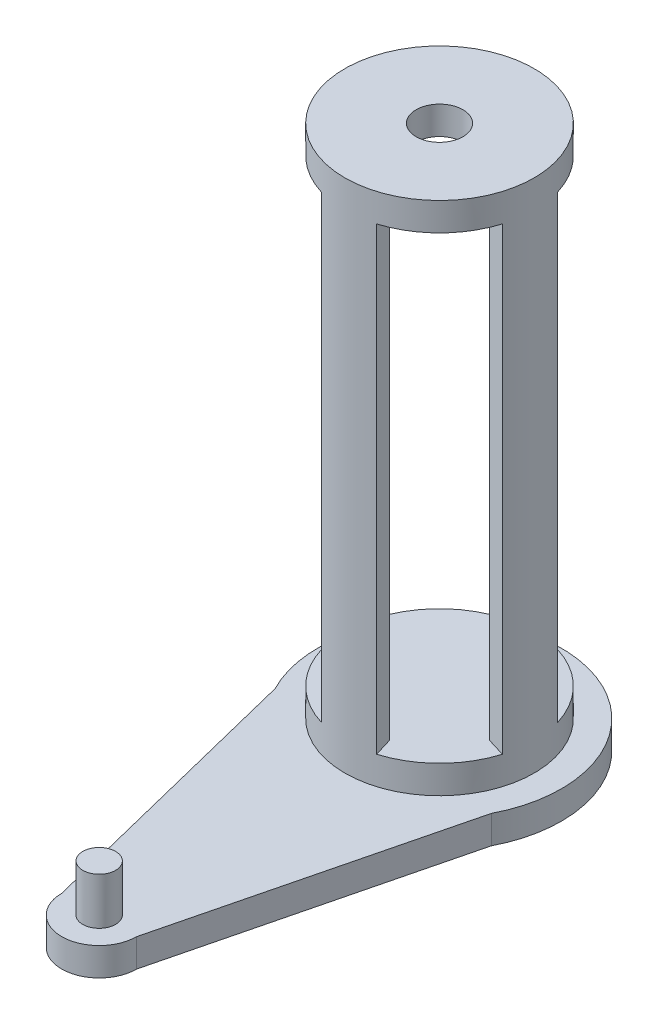
ISO-10303-21;
HEADER;
FILE_DESCRIPTION(('STEP AP214'),'2;1');
FILE_NAME('part.step','',(''),(''),'','','');
FILE_SCHEMA(('AUTOMOTIVE_DESIGN { 1 0 10303 214 1 1 1 1 }'));
ENDSEC;
DATA;
#1=APPLICATION_CONTEXT('core data for automotive mechanical design processes');
#2=APPLICATION_PROTOCOL_DEFINITION('international standard','automotive_design',2000,#1);
#3=PRODUCT_CONTEXT('',#1,'mechanical');
#4=PRODUCT('Part','Part','',(#3));
#5=PRODUCT_RELATED_PRODUCT_CATEGORY('part','',(#4));
#6=PRODUCT_DEFINITION_FORMATION('','',#4);
#7=PRODUCT_DEFINITION_CONTEXT('part definition',#1,'design');
#8=PRODUCT_DEFINITION('design','',#6,#7);
#9=PRODUCT_DEFINITION_SHAPE('','',#8);
#10=(LENGTH_UNIT() NAMED_UNIT(*) SI_UNIT(.MILLI.,.METRE.));
#11=(NAMED_UNIT(*) PLANE_ANGLE_UNIT() SI_UNIT($,.RADIAN.));
#12=(NAMED_UNIT(*) SI_UNIT($,.STERADIAN.) SOLID_ANGLE_UNIT());
#13=UNCERTAINTY_MEASURE_WITH_UNIT(LENGTH_MEASURE(1.E-05),#10,'distance_accuracy_value','');
#14=(GEOMETRIC_REPRESENTATION_CONTEXT(3) GLOBAL_UNCERTAINTY_ASSIGNED_CONTEXT((#13)) GLOBAL_UNIT_ASSIGNED_CONTEXT((#10,
#11,#12)) REPRESENTATION_CONTEXT('',''));
#15=CARTESIAN_POINT('',(0.,0.,0.));
#16=DIRECTION('',(0.,0.,1.));
#17=DIRECTION('',(1.,0.,0.));
#18=AXIS2_PLACEMENT_3D('',#15,#16,#17);
#19=CARTESIAN_POINT('',(0.,3.,0.));
#20=DIRECTION('',(0.,1.,0.));
#21=DIRECTION('',(0.,0.,1.));
#22=AXIS2_PLACEMENT_3D('',#19,#20,#21);
#23=PLANE('',#22);
#24=CARTESIAN_POINT('',(0.,3.,0.));
#25=DIRECTION('',(0.,-1.,0.));
#26=DIRECTION('',(0.,0.,1.));
#27=AXIS2_PLACEMENT_3D('',#24,#25,#26);
#28=CIRCLE('',#27,8.);
#29=CARTESIAN_POINT('',(-7.6504380477043,3.,2.33897363778182));
#30=VERTEX_POINT('',#29);
#31=CARTESIAN_POINT('',(-7.65043804770426,3.,-2.33897363778198));
#32=VERTEX_POINT('',#31);
#33=EDGE_CURVE('E48',#30,#32,#28,.T.);
#34=ORIENTED_EDGE('',*,*,#33,.F.);
#35=DIRECTION('',(0.956304755963038,0.,-0.292371704722728));
#36=VECTOR('',#35,1.);
#37=CARTESIAN_POINT('',(-9.65867803522668,3.,2.95295421769955));
#38=LINE('',#37,#36);
#39=CARTESIAN_POINT('',(-9.65867803522668,3.,2.95295421769955));
#40=VERTEX_POINT('',#39);
#41=EDGE_CURVE('E211',#40,#30,#38,.T.);
#42=ORIENTED_EDGE('',*,*,#41,.F.);
#43=CARTESIAN_POINT('',(0.,3.,0.));
#44=DIRECTION('',(0.,1.,0.));
#45=DIRECTION('',(0.,0.,1.));
#46=AXIS2_PLACEMENT_3D('',#43,#44,#45);
#47=CIRCLE('',#46,10.1);
#48=CARTESIAN_POINT('',(-2.95295421769971,3.,9.65867803522663));
#49=VERTEX_POINT('',#48);
#50=EDGE_CURVE('E328',#40,#49,#47,.T.);
#51=ORIENTED_EDGE('',*,*,#50,.T.);
#52=DIRECTION('',(-0.292371704722744,0.,0.956304755963033));
#53=VECTOR('',#52,1.);
#54=CARTESIAN_POINT('',(-2.95295421769971,3.,9.65867803522663));
#55=LINE('',#54,#53);
#56=CARTESIAN_POINT('',(-2.33897363778195,3.,7.65043804770426));
#57=VERTEX_POINT('',#56);
#58=EDGE_CURVE('E245',#57,#49,#55,.T.);
#59=ORIENTED_EDGE('',*,*,#58,.F.);
#60=CARTESIAN_POINT('',(0.,3.,0.));
#61=DIRECTION('',(0.,-1.,0.));
#62=DIRECTION('',(0.,0.,1.));
#63=AXIS2_PLACEMENT_3D('',#60,#61,#62);
#64=CIRCLE('',#63,8.);
#65=CARTESIAN_POINT('',(2.33897363778185,3.,7.6504380477043));
#66=VERTEX_POINT('',#65);
#67=EDGE_CURVE('E254',#66,#57,#64,.T.);
#68=ORIENTED_EDGE('',*,*,#67,.F.);
#69=DIRECTION('',(-0.292371704722731,0.,-0.956304755963037));
#70=VECTOR('',#69,1.);
#71=CARTESIAN_POINT('',(2.95295421769958,3.,9.65867803522667));
#72=LINE('',#71,#70);
#73=CARTESIAN_POINT('',(2.95295421769958,3.,9.65867803522667));
#74=VERTEX_POINT('',#73);
#75=EDGE_CURVE('E240',#74,#66,#72,.T.);
#76=ORIENTED_EDGE('',*,*,#75,.F.);
#77=CARTESIAN_POINT('',(9.65867803522664,3.,2.95295421769968));
#78=VERTEX_POINT('',#77);
#79=EDGE_CURVE('E330',#74,#78,#47,.T.);
#80=ORIENTED_EDGE('',*,*,#79,.T.);
#81=DIRECTION('',(0.956304755963034,0.,0.292371704722741));
#82=VECTOR('',#81,1.);
#83=CARTESIAN_POINT('',(9.65867803522664,3.,2.95295421769968));
#84=LINE('',#83,#82);
#85=CARTESIAN_POINT('',(7.65043804770427,3.,2.33897363778192));
#86=VERTEX_POINT('',#85);
#87=EDGE_CURVE('E275',#86,#78,#84,.T.);
#88=ORIENTED_EDGE('',*,*,#87,.F.);
#89=CARTESIAN_POINT('',(0.,3.,0.));
#90=DIRECTION('',(0.,-1.,0.));
#91=DIRECTION('',(0.,0.,1.));
#92=AXIS2_PLACEMENT_3D('',#89,#90,#91);
#93=CIRCLE('',#92,8.);
#94=CARTESIAN_POINT('',(7.65043804770429,3.,-2.33897363778188));
#95=VERTEX_POINT('',#94);
#96=EDGE_CURVE('E283',#95,#86,#93,.T.);
#97=ORIENTED_EDGE('',*,*,#96,.F.);
#98=DIRECTION('',(-0.956304755963036,0.,0.292371704722734));
#99=VECTOR('',#98,1.);
#100=CARTESIAN_POINT('',(9.65867803522666,3.,-2.95295421769962));
#101=LINE('',#100,#99);
#102=CARTESIAN_POINT('',(9.65867803522666,3.,-2.95295421769962));
#103=VERTEX_POINT('',#102);
#104=EDGE_CURVE('E270',#103,#95,#101,.T.);
#105=ORIENTED_EDGE('',*,*,#104,.F.);
#106=CARTESIAN_POINT('',(2.95295421769965,3.,-9.65867803522666));
#107=VERTEX_POINT('',#106);
#108=EDGE_CURVE('E327',#103,#107,#47,.T.);
#109=ORIENTED_EDGE('',*,*,#108,.T.);
#110=DIRECTION('',(0.292371704722737,0.,-0.956304755963035));
#111=VECTOR('',#110,1.);
#112=CARTESIAN_POINT('',(2.95295421769965,3.,-9.65867803522666));
#113=LINE('',#112,#111);
#114=CARTESIAN_POINT('',(2.3389736377819,3.,-7.65043804770428));
#115=VERTEX_POINT('',#114);
#116=EDGE_CURVE('E302',#115,#107,#113,.T.);
#117=ORIENTED_EDGE('',*,*,#116,.F.);
#118=CARTESIAN_POINT('',(0.,3.,0.));
#119=DIRECTION('',(0.,-1.,0.));
#120=DIRECTION('',(0.,0.,1.));
#121=AXIS2_PLACEMENT_3D('',#118,#119,#120);
#122=CIRCLE('',#121,8.);
#123=CARTESIAN_POINT('',(-2.3389736377819,3.,-7.65043804770428));
#124=VERTEX_POINT('',#123);
#125=EDGE_CURVE('E311',#124,#115,#122,.T.);
#126=ORIENTED_EDGE('',*,*,#125,.F.);
#127=DIRECTION('',(0.292371704722738,0.,0.956304755963035));
#128=VECTOR('',#127,1.);
#129=CARTESIAN_POINT('',(-2.95295421769965,3.,-9.65867803522665));
#130=LINE('',#129,#128);
#131=CARTESIAN_POINT('',(-2.95295421769965,3.,-9.65867803522666));
#132=VERTEX_POINT('',#131);
#133=EDGE_CURVE('E297',#132,#124,#130,.T.);
#134=ORIENTED_EDGE('',*,*,#133,.F.);
#135=CARTESIAN_POINT('',(-9.65867803522662,3.,-2.95295421769975));
#136=VERTEX_POINT('',#135);
#137=EDGE_CURVE('E41',#132,#136,#47,.T.);
#138=ORIENTED_EDGE('',*,*,#137,.T.);
#139=DIRECTION('',(-0.956304755963032,0.,-0.292371704722747));
#140=VECTOR('',#139,1.);
#141=CARTESIAN_POINT('',(-9.65867803522662,3.,-2.95295421769975));
#142=LINE('',#141,#140);
#143=EDGE_CURVE('E53',#32,#136,#142,.T.);
#144=ORIENTED_EDGE('',*,*,#143,.F.);
#145=EDGE_LOOP('',(#34,#42,#51,#59,#68,#76,#80,#88,#97,#105,#109,#117,#126,#134,#138,#144));
#146=FACE_BOUND('',#145,.T.);
#147=ADVANCED_FACE('F33',(#146),#23,.T.);
#148=CARTESIAN_POINT('',(0.,3.,0.));
#149=DIRECTION('',(0.,-1.,0.));
#150=DIRECTION('',(0.,0.,-1.));
#151=AXIS2_PLACEMENT_3D('',#148,#149,#150);
#152=CYLINDRICAL_SURFACE('',#151,10.1);
#153=DIRECTION('',(0.,-1.,0.));
#154=VECTOR('',#153,1.);
#155=CARTESIAN_POINT('',(-2.95295421769965,52.,-9.65867803522665));
#156=LINE('',#155,#154);
#157=CARTESIAN_POINT('',(-2.95295421769965,52.,-9.65867803522665));
#158=VERTEX_POINT('',#157);
#159=EDGE_CURVE('E324',#158,#132,#156,.T.);
#160=ORIENTED_EDGE('',*,*,#159,.F.);
#161=CARTESIAN_POINT('',(0.,52.,0.));
#162=DIRECTION('',(0.,1.,0.));
#163=DIRECTION('',(0.,0.,1.));
#164=AXIS2_PLACEMENT_3D('',#161,#162,#163);
#165=CIRCLE('',#164,10.1);
#166=CARTESIAN_POINT('',(-9.65867803522662,52.,-2.95295421769975));
#167=VERTEX_POINT('',#166);
#168=EDGE_CURVE('E365',#158,#167,#165,.T.);
#169=ORIENTED_EDGE('',*,*,#168,.T.);
#170=DIRECTION('',(0.,-1.,0.));
#171=VECTOR('',#170,1.);
#172=CARTESIAN_POINT('',(-9.65867803522662,52.,-2.95295421769975));
#173=LINE('',#172,#171);
#174=EDGE_CURVE('E225',#167,#136,#173,.T.);
#175=ORIENTED_EDGE('',*,*,#174,.T.);
#176=ORIENTED_EDGE('',*,*,#137,.F.);
#177=EDGE_LOOP('',(#160,#169,#175,#176));
#178=FACE_BOUND('',#177,.T.);
#179=DIRECTION('',(0.,-1.,0.));
#180=VECTOR('',#179,1.);
#181=CARTESIAN_POINT('',(9.65867803522666,52.,-2.95295421769962));
#182=LINE('',#181,#180);
#183=CARTESIAN_POINT('',(9.65867803522666,52.,-2.95295421769962));
#184=VERTEX_POINT('',#183);
#185=EDGE_CURVE('E295',#184,#103,#182,.T.);
#186=ORIENTED_EDGE('',*,*,#185,.F.);
#187=CARTESIAN_POINT('',(2.95295421769965,52.,-9.65867803522666));
#188=VERTEX_POINT('',#187);
#189=EDGE_CURVE('E215',#184,#188,#165,.T.);
#190=ORIENTED_EDGE('',*,*,#189,.T.);
#191=DIRECTION('',(0.,-1.,0.));
#192=VECTOR('',#191,1.);
#193=CARTESIAN_POINT('',(2.95295421769965,52.,-9.65867803522666));
#194=LINE('',#193,#192);
#195=EDGE_CURVE('E308',#188,#107,#194,.T.);
#196=ORIENTED_EDGE('',*,*,#195,.T.);
#197=ORIENTED_EDGE('',*,*,#108,.F.);
#198=EDGE_LOOP('',(#186,#190,#196,#197));
#199=FACE_BOUND('',#198,.T.);
#200=DIRECTION('',(0.,-1.,0.));
#201=VECTOR('',#200,1.);
#202=CARTESIAN_POINT('',(2.95295421769958,52.,9.65867803522667));
#203=LINE('',#202,#201);
#204=CARTESIAN_POINT('',(2.95295421769958,52.,9.65867803522667));
#205=VERTEX_POINT('',#204);
#206=EDGE_CURVE('E267',#205,#74,#203,.T.);
#207=ORIENTED_EDGE('',*,*,#206,.F.);
#208=CARTESIAN_POINT('',(9.65867803522664,52.,2.95295421769968));
#209=VERTEX_POINT('',#208);
#210=EDGE_CURVE('E212',#205,#209,#165,.T.);
#211=ORIENTED_EDGE('',*,*,#210,.T.);
#212=DIRECTION('',(0.,-1.,0.));
#213=VECTOR('',#212,1.);
#214=CARTESIAN_POINT('',(9.65867803522664,52.,2.95295421769968));
#215=LINE('',#214,#213);
#216=EDGE_CURVE('E281',#209,#78,#215,.T.);
#217=ORIENTED_EDGE('',*,*,#216,.T.);
#218=ORIENTED_EDGE('',*,*,#79,.F.);
#219=EDGE_LOOP('',(#207,#211,#217,#218));
#220=FACE_BOUND('',#219,.T.);
#221=CARTESIAN_POINT('',(-9.65867803522668,52.,2.95295421769955));
#222=VERTEX_POINT('',#221);
#223=CARTESIAN_POINT('',(-2.95295421769971,52.,9.65867803522663));
#224=VERTEX_POINT('',#223);
#225=EDGE_CURVE('E205',#222,#224,#165,.T.);
#226=ORIENTED_EDGE('',*,*,#225,.T.);
#227=DIRECTION('',(0.,-1.,0.));
#228=VECTOR('',#227,1.);
#229=CARTESIAN_POINT('',(-2.95295421769971,52.,9.65867803522663));
#230=LINE('',#229,#228);
#231=EDGE_CURVE('E251',#224,#49,#230,.T.);
#232=ORIENTED_EDGE('',*,*,#231,.T.);
#233=ORIENTED_EDGE('',*,*,#50,.F.);
#234=DIRECTION('',(0.,-1.,0.));
#235=VECTOR('',#234,1.);
#236=CARTESIAN_POINT('',(-9.65867803522668,52.,2.95295421769955));
#237=LINE('',#236,#235);
#238=EDGE_CURVE('E237',#222,#40,#237,.T.);
#239=ORIENTED_EDGE('',*,*,#238,.F.);
#240=EDGE_LOOP('',(#226,#232,#233,#239));
#241=FACE_BOUND('',#240,.T.);
#242=CARTESIAN_POINT('',(0.,0.,0.));
#243=DIRECTION('',(0.,1.,0.));
#244=DIRECTION('',(0.,0.,1.));
#245=AXIS2_PLACEMENT_3D('',#242,#243,#244);
#246=CIRCLE('',#245,10.1);
#247=CARTESIAN_POINT('',(0.,0.,10.1));
#248=VERTEX_POINT('',#247);
#249=EDGE_CURVE('E194',#248,#248,#246,.T.);
#250=ORIENTED_EDGE('',*,*,#249,.T.);
#251=EDGE_LOOP('',(#250));
#252=FACE_BOUND('',#251,.T.);
#253=CARTESIAN_POINT('',(0.,55.,0.));
#254=DIRECTION('',(0.,1.,0.));
#255=DIRECTION('',(0.,0.,1.));
#256=AXIS2_PLACEMENT_3D('',#253,#254,#255);
#257=CIRCLE('',#256,10.1);
#258=CARTESIAN_POINT('',(0.,55.,10.1));
#259=VERTEX_POINT('',#258);
#260=EDGE_CURVE('E208',#259,#259,#257,.T.);
#261=ORIENTED_EDGE('',*,*,#260,.F.);
#262=EDGE_LOOP('',(#261));
#263=FACE_BOUND('',#262,.T.);
#264=ADVANCED_FACE('F35',(#178,#199,#220,#241,#252,#263),#152,.T.);
#265=CARTESIAN_POINT('',(-2.95295421769965,52.,-9.65867803522665));
#266=DIRECTION('',(0.956304755963035,0.,-0.292371704722738));
#267=DIRECTION('',(-0.292371704722738,0.,-0.956304755963035));
#268=AXIS2_PLACEMENT_3D('',#265,#266,#267);
#269=PLANE('',#268);
#270=ORIENTED_EDGE('',*,*,#133,.T.);
#271=DIRECTION('',(0.,-1.,0.));
#272=VECTOR('',#271,1.);
#273=CARTESIAN_POINT('',(-2.3389736377819,52.,-7.65043804770428));
#274=LINE('',#273,#272);
#275=CARTESIAN_POINT('',(-2.3389736377819,52.,-7.65043804770428));
#276=VERTEX_POINT('',#275);
#277=EDGE_CURVE('E321',#276,#124,#274,.T.);
#278=ORIENTED_EDGE('',*,*,#277,.F.);
#279=DIRECTION('',(0.292371704722738,0.,0.956304755963035));
#280=VECTOR('',#279,1.);
#281=CARTESIAN_POINT('',(-2.95295421769965,52.,-9.65867803522665));
#282=LINE('',#281,#280);
#283=EDGE_CURVE('E298',#158,#276,#282,.T.);
#284=ORIENTED_EDGE('',*,*,#283,.F.);
#285=ORIENTED_EDGE('',*,*,#159,.T.);
#286=EDGE_LOOP('',(#270,#278,#284,#285));
#287=FACE_BOUND('',#286,.T.);
#288=ADVANCED_FACE('F362',(#287),#269,.F.);
#289=CARTESIAN_POINT('',(0.,52.,0.));
#290=DIRECTION('',(0.,-1.,0.));
#291=DIRECTION('',(0.,0.,-1.));
#292=AXIS2_PLACEMENT_3D('',#289,#290,#291);
#293=CYLINDRICAL_SURFACE('',#292,8.);
#294=ORIENTED_EDGE('',*,*,#125,.T.);
#295=DIRECTION('',(0.,-1.,0.));
#296=VECTOR('',#295,1.);
#297=CARTESIAN_POINT('',(2.3389736377819,52.,-7.65043804770428));
#298=LINE('',#297,#296);
#299=CARTESIAN_POINT('',(2.3389736377819,52.,-7.65043804770428));
#300=VERTEX_POINT('',#299);
#301=EDGE_CURVE('E318',#300,#115,#298,.T.);
#302=ORIENTED_EDGE('',*,*,#301,.F.);
#303=CARTESIAN_POINT('',(0.,52.,0.));
#304=DIRECTION('',(0.,-1.,0.));
#305=DIRECTION('',(0.,0.,1.));
#306=AXIS2_PLACEMENT_3D('',#303,#304,#305);
#307=CIRCLE('',#306,8.);
#308=EDGE_CURVE('E301',#276,#300,#307,.T.);
#309=ORIENTED_EDGE('',*,*,#308,.F.);
#310=ORIENTED_EDGE('',*,*,#277,.T.);
#311=EDGE_LOOP('',(#294,#302,#309,#310));
#312=FACE_BOUND('',#311,.T.);
#313=ADVANCED_FACE('F360',(#312),#293,.F.);
#314=CARTESIAN_POINT('',(2.95295421769965,52.,-9.65867803522666));
#315=DIRECTION('',(-0.956304755963035,0.,-0.292371704722737));
#316=DIRECTION('',(-0.292371704722737,0.,0.956304755963035));
#317=AXIS2_PLACEMENT_3D('',#314,#315,#316);
#318=PLANE('',#317);
#319=ORIENTED_EDGE('',*,*,#116,.T.);
#320=ORIENTED_EDGE('',*,*,#195,.F.);
#321=DIRECTION('',(0.292371704722737,0.,-0.956304755963035));
#322=VECTOR('',#321,1.);
#323=CARTESIAN_POINT('',(2.95295421769965,52.,-9.65867803522666));
#324=LINE('',#323,#322);
#325=EDGE_CURVE('E305',#300,#188,#324,.T.);
#326=ORIENTED_EDGE('',*,*,#325,.F.);
#327=ORIENTED_EDGE('',*,*,#301,.T.);
#328=EDGE_LOOP('',(#319,#320,#326,#327));
#329=FACE_BOUND('',#328,.T.);
#330=ADVANCED_FACE('F356',(#329),#318,.F.);
#331=CARTESIAN_POINT('',(9.65867803522666,52.,-2.95295421769962));
#332=DIRECTION('',(0.292371704722734,0.,0.956304755963036));
#333=DIRECTION('',(0.956304755963036,0.,-0.292371704722735));
#334=AXIS2_PLACEMENT_3D('',#331,#332,#333);
#335=PLANE('',#334);
#336=ORIENTED_EDGE('',*,*,#104,.T.);
#337=DIRECTION('',(0.,-1.,0.));
#338=VECTOR('',#337,1.);
#339=CARTESIAN_POINT('',(7.65043804770429,52.,-2.33897363778188));
#340=LINE('',#339,#338);
#341=CARTESIAN_POINT('',(7.65043804770429,52.,-2.33897363778188));
#342=VERTEX_POINT('',#341);
#343=EDGE_CURVE('E292',#342,#95,#340,.T.);
#344=ORIENTED_EDGE('',*,*,#343,.F.);
#345=DIRECTION('',(-0.956304755963036,0.,0.292371704722734));
#346=VECTOR('',#345,1.);
#347=CARTESIAN_POINT('',(9.65867803522666,52.,-2.95295421769962));
#348=LINE('',#347,#346);
#349=EDGE_CURVE('E271',#184,#342,#348,.T.);
#350=ORIENTED_EDGE('',*,*,#349,.F.);
#351=ORIENTED_EDGE('',*,*,#185,.T.);
#352=EDGE_LOOP('',(#336,#344,#350,#351));
#353=FACE_BOUND('',#352,.T.);
#354=ADVANCED_FACE('F405',(#353),#335,.F.);
#355=CARTESIAN_POINT('',(0.,52.,0.));
#356=DIRECTION('',(0.,-1.,0.));
#357=DIRECTION('',(0.,0.,-1.));
#358=AXIS2_PLACEMENT_3D('',#355,#356,#357);
#359=CYLINDRICAL_SURFACE('',#358,8.);
#360=ORIENTED_EDGE('',*,*,#96,.T.);
#361=DIRECTION('',(0.,-1.,0.));
#362=VECTOR('',#361,1.);
#363=CARTESIAN_POINT('',(7.65043804770427,52.,2.33897363778192));
#364=LINE('',#363,#362);
#365=CARTESIAN_POINT('',(7.65043804770427,52.,2.33897363778192));
#366=VERTEX_POINT('',#365);
#367=EDGE_CURVE('E290',#366,#86,#364,.T.);
#368=ORIENTED_EDGE('',*,*,#367,.F.);
#369=CARTESIAN_POINT('',(0.,52.,0.));
#370=DIRECTION('',(0.,-1.,0.));
#371=DIRECTION('',(0.,0.,1.));
#372=AXIS2_PLACEMENT_3D('',#369,#370,#371);
#373=CIRCLE('',#372,8.);
#374=EDGE_CURVE('E274',#342,#366,#373,.T.);
#375=ORIENTED_EDGE('',*,*,#374,.F.);
#376=ORIENTED_EDGE('',*,*,#343,.T.);
#377=EDGE_LOOP('',(#360,#368,#375,#376));
#378=FACE_BOUND('',#377,.T.);
#379=ADVANCED_FACE('F350',(#378),#359,.F.);
#380=CARTESIAN_POINT('',(9.65867803522664,52.,2.95295421769968));
#381=DIRECTION('',(0.292371704722741,0.,-0.956304755963034));
#382=DIRECTION('',(-0.956304755963034,0.,-0.292371704722741));
#383=AXIS2_PLACEMENT_3D('',#380,#381,#382);
#384=PLANE('',#383);
#385=ORIENTED_EDGE('',*,*,#87,.T.);
#386=ORIENTED_EDGE('',*,*,#216,.F.);
#387=DIRECTION('',(0.956304755963034,0.,0.292371704722741));
#388=VECTOR('',#387,1.);
#389=CARTESIAN_POINT('',(9.65867803522664,52.,2.95295421769968));
#390=LINE('',#389,#388);
#391=EDGE_CURVE('E278',#366,#209,#390,.T.);
#392=ORIENTED_EDGE('',*,*,#391,.F.);
#393=ORIENTED_EDGE('',*,*,#367,.T.);
#394=EDGE_LOOP('',(#385,#386,#392,#393));
#395=FACE_BOUND('',#394,.T.);
#396=ADVANCED_FACE('F338',(#395),#384,.F.);
#397=CARTESIAN_POINT('',(2.95295421769958,52.,9.65867803522667));
#398=DIRECTION('',(-0.956304755963037,0.,0.292371704722731));
#399=DIRECTION('',(0.292371704722731,0.,0.956304755963037));
#400=AXIS2_PLACEMENT_3D('',#397,#398,#399);
#401=PLANE('',#400);
#402=ORIENTED_EDGE('',*,*,#75,.T.);
#403=DIRECTION('',(0.,-1.,0.));
#404=VECTOR('',#403,1.);
#405=CARTESIAN_POINT('',(2.33897363778185,52.,7.6504380477043));
#406=LINE('',#405,#404);
#407=CARTESIAN_POINT('',(2.33897363778185,52.,7.6504380477043));
#408=VERTEX_POINT('',#407);
#409=EDGE_CURVE('E264',#408,#66,#406,.T.);
#410=ORIENTED_EDGE('',*,*,#409,.F.);
#411=DIRECTION('',(-0.292371704722731,0.,-0.956304755963037));
#412=VECTOR('',#411,1.);
#413=CARTESIAN_POINT('',(2.95295421769958,52.,9.65867803522667));
#414=LINE('',#413,#412);
#415=EDGE_CURVE('E241',#205,#408,#414,.T.);
#416=ORIENTED_EDGE('',*,*,#415,.F.);
#417=ORIENTED_EDGE('',*,*,#206,.T.);
#418=EDGE_LOOP('',(#402,#410,#416,#417));
#419=FACE_BOUND('',#418,.T.);
#420=ADVANCED_FACE('F385',(#419),#401,.F.);
#421=CARTESIAN_POINT('',(0.,52.,0.));
#422=DIRECTION('',(0.,-1.,0.));
#423=DIRECTION('',(0.,0.,-1.));
#424=AXIS2_PLACEMENT_3D('',#421,#422,#423);
#425=CYLINDRICAL_SURFACE('',#424,8.);
#426=ORIENTED_EDGE('',*,*,#67,.T.);
#427=DIRECTION('',(0.,-1.,0.));
#428=VECTOR('',#427,1.);
#429=CARTESIAN_POINT('',(-2.33897363778195,52.,7.65043804770426));
#430=LINE('',#429,#428);
#431=CARTESIAN_POINT('',(-2.33897363778195,52.,7.65043804770426));
#432=VERTEX_POINT('',#431);
#433=EDGE_CURVE('E261',#432,#57,#430,.T.);
#434=ORIENTED_EDGE('',*,*,#433,.F.);
#435=CARTESIAN_POINT('',(0.,52.,0.));
#436=DIRECTION('',(0.,-1.,0.));
#437=DIRECTION('',(0.,0.,1.));
#438=AXIS2_PLACEMENT_3D('',#435,#436,#437);
#439=CIRCLE('',#438,8.);
#440=EDGE_CURVE('E244',#408,#432,#439,.T.);
#441=ORIENTED_EDGE('',*,*,#440,.F.);
#442=ORIENTED_EDGE('',*,*,#409,.T.);
#443=EDGE_LOOP('',(#426,#434,#441,#442));
#444=FACE_BOUND('',#443,.T.);
#445=ADVANCED_FACE('F383',(#444),#425,.F.);
#446=CARTESIAN_POINT('',(-2.95295421769971,52.,9.65867803522663));
#447=DIRECTION('',(0.956304755963033,0.,0.292371704722744));
#448=DIRECTION('',(0.292371704722744,0.,-0.956304755963033));
#449=AXIS2_PLACEMENT_3D('',#446,#447,#448);
#450=PLANE('',#449);
#451=ORIENTED_EDGE('',*,*,#58,.T.);
#452=ORIENTED_EDGE('',*,*,#231,.F.);
#453=DIRECTION('',(-0.292371704722744,0.,0.956304755963033));
#454=VECTOR('',#453,1.);
#455=CARTESIAN_POINT('',(-2.95295421769971,52.,9.65867803522663));
#456=LINE('',#455,#454);
#457=EDGE_CURVE('E248',#432,#224,#456,.T.);
#458=ORIENTED_EDGE('',*,*,#457,.F.);
#459=ORIENTED_EDGE('',*,*,#433,.T.);
#460=EDGE_LOOP('',(#451,#452,#458,#459));
#461=FACE_BOUND('',#460,.T.);
#462=ADVANCED_FACE('F377',(#461),#450,.F.);
#463=CARTESIAN_POINT('',(-9.65867803522668,52.,2.95295421769955));
#464=DIRECTION('',(-0.292371704722728,0.,-0.956304755963038));
#465=DIRECTION('',(-0.956304755963038,0.,0.292371704722728));
#466=AXIS2_PLACEMENT_3D('',#463,#464,#465);
#467=PLANE('',#466);
#468=ORIENTED_EDGE('',*,*,#41,.T.);
#469=DIRECTION('',(0.,-1.,0.));
#470=VECTOR('',#469,1.);
#471=CARTESIAN_POINT('',(-7.6504380477043,52.,2.33897363778182));
#472=LINE('',#471,#470);
#473=CARTESIAN_POINT('',(-7.6504380477043,52.,2.33897363778182));
#474=VERTEX_POINT('',#473);
#475=EDGE_CURVE('E234',#474,#30,#472,.T.);
#476=ORIENTED_EDGE('',*,*,#475,.F.);
#477=DIRECTION('',(0.956304755963038,0.,-0.292371704722728));
#478=VECTOR('',#477,1.);
#479=CARTESIAN_POINT('',(-9.65867803522668,52.,2.95295421769955));
#480=LINE('',#479,#478);
#481=EDGE_CURVE('E216',#222,#474,#480,.T.);
#482=ORIENTED_EDGE('',*,*,#481,.F.);
#483=ORIENTED_EDGE('',*,*,#238,.T.);
#484=EDGE_LOOP('',(#468,#476,#482,#483));
#485=FACE_BOUND('',#484,.T.);
#486=ADVANCED_FACE('F375',(#485),#467,.F.);
#487=CARTESIAN_POINT('',(0.,52.,0.));
#488=DIRECTION('',(0.,-1.,0.));
#489=DIRECTION('',(0.,0.,-1.));
#490=AXIS2_PLACEMENT_3D('',#487,#488,#489);
#491=CYLINDRICAL_SURFACE('',#490,8.);
#492=ORIENTED_EDGE('',*,*,#33,.T.);
#493=DIRECTION('',(0.,-1.,0.));
#494=VECTOR('',#493,1.);
#495=CARTESIAN_POINT('',(-7.65043804770426,52.,-2.33897363778198));
#496=LINE('',#495,#494);
#497=CARTESIAN_POINT('',(-7.65043804770426,52.,-2.33897363778198));
#498=VERTEX_POINT('',#497);
#499=EDGE_CURVE('E231',#498,#32,#496,.T.);
#500=ORIENTED_EDGE('',*,*,#499,.F.);
#501=CARTESIAN_POINT('',(0.,52.,0.));
#502=DIRECTION('',(0.,-1.,0.));
#503=DIRECTION('',(0.,0.,1.));
#504=AXIS2_PLACEMENT_3D('',#501,#502,#503);
#505=CIRCLE('',#504,8.);
#506=EDGE_CURVE('E219',#474,#498,#505,.T.);
#507=ORIENTED_EDGE('',*,*,#506,.F.);
#508=ORIENTED_EDGE('',*,*,#475,.T.);
#509=EDGE_LOOP('',(#492,#500,#507,#508));
#510=FACE_BOUND('',#509,.T.);
#511=ADVANCED_FACE('F373',(#510),#491,.F.);
#512=CARTESIAN_POINT('',(-9.65867803522662,52.,-2.95295421769975));
#513=DIRECTION('',(-0.292371704722747,0.,0.956304755963032));
#514=DIRECTION('',(0.956304755963032,0.,0.292371704722747));
#515=AXIS2_PLACEMENT_3D('',#512,#513,#514);
#516=PLANE('',#515);
#517=ORIENTED_EDGE('',*,*,#143,.T.);
#518=ORIENTED_EDGE('',*,*,#174,.F.);
#519=DIRECTION('',(-0.956304755963032,0.,-0.292371704722747));
#520=VECTOR('',#519,1.);
#521=CARTESIAN_POINT('',(-9.65867803522662,52.,-2.95295421769975));
#522=LINE('',#521,#520);
#523=EDGE_CURVE('E222',#498,#167,#522,.T.);
#524=ORIENTED_EDGE('',*,*,#523,.F.);
#525=ORIENTED_EDGE('',*,*,#499,.T.);
#526=EDGE_LOOP('',(#517,#518,#524,#525));
#527=FACE_BOUND('',#526,.T.);
#528=ADVANCED_FACE('F368',(#527),#516,.F.);
#529=CARTESIAN_POINT('',(0.,52.,0.));
#530=DIRECTION('',(0.,1.,0.));
#531=DIRECTION('',(0.,0.,1.));
#532=AXIS2_PLACEMENT_3D('',#529,#530,#531);
#533=PLANE('',#532);
#534=CARTESIAN_POINT('',(0.,52.,0.));
#535=DIRECTION('',(0.,1.,0.));
#536=DIRECTION('',(0.,0.,1.));
#537=AXIS2_PLACEMENT_3D('',#534,#535,#536);
#538=CIRCLE('',#537,2.5);
#539=CARTESIAN_POINT('',(0.,52.,2.5));
#540=VERTEX_POINT('',#539);
#541=EDGE_CURVE('E197',#540,#540,#538,.T.);
#542=ORIENTED_EDGE('',*,*,#541,.T.);
#543=EDGE_LOOP('',(#542));
#544=FACE_BOUND('',#543,.T.);
#545=ORIENTED_EDGE('',*,*,#168,.F.);
#546=ORIENTED_EDGE('',*,*,#283,.T.);
#547=ORIENTED_EDGE('',*,*,#308,.T.);
#548=ORIENTED_EDGE('',*,*,#325,.T.);
#549=ORIENTED_EDGE('',*,*,#189,.F.);
#550=ORIENTED_EDGE('',*,*,#349,.T.);
#551=ORIENTED_EDGE('',*,*,#374,.T.);
#552=ORIENTED_EDGE('',*,*,#391,.T.);
#553=ORIENTED_EDGE('',*,*,#210,.F.);
#554=ORIENTED_EDGE('',*,*,#415,.T.);
#555=ORIENTED_EDGE('',*,*,#440,.T.);
#556=ORIENTED_EDGE('',*,*,#457,.T.);
#557=ORIENTED_EDGE('',*,*,#225,.F.);
#558=ORIENTED_EDGE('',*,*,#481,.T.);
#559=ORIENTED_EDGE('',*,*,#506,.T.);
#560=ORIENTED_EDGE('',*,*,#523,.T.);
#561=EDGE_LOOP('',(#545,#546,#547,#548,#549,#550,#551,#552,#553,#554,#555,#556,#557,#558,#559,#560));
#562=FACE_BOUND('',#561,.T.);
#563=ADVANCED_FACE('F345',(#544,#562),#533,.F.);
#564=CARTESIAN_POINT('',(0.,55.,0.));
#565=DIRECTION('',(0.,1.,0.));
#566=DIRECTION('',(0.,0.,1.));
#567=AXIS2_PLACEMENT_3D('',#564,#565,#566);
#568=PLANE('',#567);
#569=ORIENTED_EDGE('',*,*,#260,.T.);
#570=EDGE_LOOP('',(#569));
#571=FACE_BOUND('',#570,.T.);
#572=CARTESIAN_POINT('',(0.,55.,0.));
#573=DIRECTION('',(0.,1.,0.));
#574=DIRECTION('',(0.,0.,1.));
#575=AXIS2_PLACEMENT_3D('',#572,#573,#574);
#576=CIRCLE('',#575,2.5);
#577=CARTESIAN_POINT('',(0.,55.,2.5));
#578=VERTEX_POINT('',#577);
#579=EDGE_CURVE('E202',#578,#578,#576,.T.);
#580=ORIENTED_EDGE('',*,*,#579,.F.);
#581=EDGE_LOOP('',(#580));
#582=FACE_BOUND('',#581,.T.);
#583=ADVANCED_FACE('F469',(#571,#582),#568,.T.);
#584=CARTESIAN_POINT('',(0.,55.,0.));
#585=DIRECTION('',(0.,-1.,0.));
#586=DIRECTION('',(0.,0.,-1.));
#587=AXIS2_PLACEMENT_3D('',#584,#585,#586);
#588=CYLINDRICAL_SURFACE('',#587,2.5);
#589=ORIENTED_EDGE('',*,*,#579,.T.);
#590=EDGE_LOOP('',(#589));
#591=FACE_BOUND('',#590,.T.);
#592=ORIENTED_EDGE('',*,*,#541,.F.);
#593=EDGE_LOOP('',(#592));
#594=FACE_BOUND('',#593,.T.);
#595=ADVANCED_FACE('F479',(#591,#594),#588,.F.);
#596=CARTESIAN_POINT('',(0.,-3.,0.));
#597=DIRECTION('',(0.,1.,0.));
#598=DIRECTION('',(0.,0.,1.));
#599=AXIS2_PLACEMENT_3D('',#596,#597,#598);
#600=CYLINDRICAL_SURFACE('',#599,13.);
#601=CARTESIAN_POINT('',(0.,0.,0.));
#602=DIRECTION('',(0.,-1.,0.));
#603=DIRECTION('',(0.,0.,-1.));
#604=AXIS2_PLACEMENT_3D('',#601,#602,#603);
#605=CIRCLE('',#604,13.);
#606=CARTESIAN_POINT('',(-11.5326495917059,0.,5.99983278058026));
#607=VERTEX_POINT('',#606);
#608=CARTESIAN_POINT('',(11.5326495917059,0.,5.99983278058026));
#609=VERTEX_POINT('',#608);
#610=EDGE_CURVE('E193',#607,#609,#605,.T.);
#611=ORIENTED_EDGE('',*,*,#610,.T.);
#612=DIRECTION('',(0.,1.,0.));
#613=VECTOR('',#612,1.);
#614=CARTESIAN_POINT('',(11.5326495917059,-3.,5.99983278058026));
#615=LINE('',#614,#613);
#616=CARTESIAN_POINT('',(11.5326495917059,-3.,5.99983278058026));
#617=VERTEX_POINT('',#616);
#618=EDGE_CURVE('E173',#617,#609,#615,.T.);
#619=ORIENTED_EDGE('',*,*,#618,.F.);
#620=CARTESIAN_POINT('',(0.,-3.,0.));
#621=DIRECTION('',(0.,-1.,0.));
#622=DIRECTION('',(0.,0.,-1.));
#623=AXIS2_PLACEMENT_3D('',#620,#621,#622);
#624=CIRCLE('',#623,13.);
#625=CARTESIAN_POINT('',(-11.5326495917059,-3.,5.99983278058026));
#626=VERTEX_POINT('',#625);
#627=EDGE_CURVE('E180',#626,#617,#624,.T.);
#628=ORIENTED_EDGE('',*,*,#627,.F.);
#629=DIRECTION('',(0.,1.,0.));
#630=VECTOR('',#629,1.);
#631=CARTESIAN_POINT('',(-11.5326495917059,-3.,5.99983278058026));
#632=LINE('',#631,#630);
#633=EDGE_CURVE('E575',#626,#607,#632,.T.);
#634=ORIENTED_EDGE('',*,*,#633,.T.);
#635=EDGE_LOOP('',(#611,#619,#628,#634));
#636=FACE_BOUND('',#635,.T.);
#637=ADVANCED_FACE('F191',(#636),#600,.T.);
#638=CARTESIAN_POINT('',(11.5326495917059,-3.,5.99983278058026));
#639=DIRECTION('',(-0.97047976208675,0.,-0.2411825685659));
#640=DIRECTION('',(-0.2411825685659,0.,0.97047976208675));
#641=AXIS2_PLACEMENT_3D('',#638,#639,#640);
#642=PLANE('',#641);
#643=DIRECTION('',(-0.2411825685659,0.,0.97047976208675));
#644=VECTOR('',#643,1.);
#645=CARTESIAN_POINT('',(11.5326495917059,0.,5.99983278058026));
#646=LINE('',#645,#644);
#647=CARTESIAN_POINT('',(4.,0.,36.31));
#648=VERTEX_POINT('',#647);
#649=EDGE_CURVE('E571',#609,#648,#646,.T.);
#650=ORIENTED_EDGE('',*,*,#649,.T.);
#651=DIRECTION('',(0.,1.,0.));
#652=VECTOR('',#651,1.);
#653=CARTESIAN_POINT('',(4.,-3.,36.31));
#654=LINE('',#653,#652);
#655=CARTESIAN_POINT('',(4.,-3.,36.31));
#656=VERTEX_POINT('',#655);
#657=EDGE_CURVE('E176',#656,#648,#654,.T.);
#658=ORIENTED_EDGE('',*,*,#657,.F.);
#659=DIRECTION('',(-0.2411825685659,0.,0.97047976208675));
#660=VECTOR('',#659,1.);
#661=CARTESIAN_POINT('',(11.5326495917059,-3.,5.99983278058026));
#662=LINE('',#661,#660);
#663=EDGE_CURVE('E169',#617,#656,#662,.T.);
#664=ORIENTED_EDGE('',*,*,#663,.F.);
#665=ORIENTED_EDGE('',*,*,#618,.T.);
#666=EDGE_LOOP('',(#650,#658,#664,#665));
#667=FACE_BOUND('',#666,.T.);
#668=ADVANCED_FACE('F171',(#667),#642,.F.);
#669=CARTESIAN_POINT('',(0.,-3.,36.31));
#670=DIRECTION('',(0.,1.,0.));
#671=DIRECTION('',(0.,0.,1.));
#672=AXIS2_PLACEMENT_3D('',#669,#670,#671);
#673=CYLINDRICAL_SURFACE('',#672,4.);
#674=CARTESIAN_POINT('',(0.,0.,36.31));
#675=DIRECTION('',(0.,-1.,0.));
#676=DIRECTION('',(0.,0.,-1.));
#677=AXIS2_PLACEMENT_3D('',#674,#675,#676);
#678=CIRCLE('',#677,4.);
#679=CARTESIAN_POINT('',(-4.,0.,36.31));
#680=VERTEX_POINT('',#679);
#681=EDGE_CURVE('E578',#648,#680,#678,.T.);
#682=ORIENTED_EDGE('',*,*,#681,.T.);
#683=DIRECTION('',(0.,1.,0.));
#684=VECTOR('',#683,1.);
#685=CARTESIAN_POINT('',(-4.,-3.,36.31));
#686=LINE('',#685,#684);
#687=CARTESIAN_POINT('',(-4.,-3.,36.31));
#688=VERTEX_POINT('',#687);
#689=EDGE_CURVE('E198',#688,#680,#686,.T.);
#690=ORIENTED_EDGE('',*,*,#689,.F.);
#691=CARTESIAN_POINT('',(0.,-3.,36.31));
#692=DIRECTION('',(0.,-1.,0.));
#693=DIRECTION('',(0.,0.,-1.));
#694=AXIS2_PLACEMENT_3D('',#691,#692,#693);
#695=CIRCLE('',#694,4.);
#696=EDGE_CURVE('E179',#656,#688,#695,.T.);
#697=ORIENTED_EDGE('',*,*,#696,.F.);
#698=ORIENTED_EDGE('',*,*,#657,.T.);
#699=EDGE_LOOP('',(#682,#690,#697,#698));
#700=FACE_BOUND('',#699,.T.);
#701=ADVANCED_FACE('F506',(#700),#673,.T.);
#702=CARTESIAN_POINT('',(-11.5326495917059,-3.,5.99983278058026));
#703=DIRECTION('',(0.97047976208675,0.,-0.2411825685659));
#704=DIRECTION('',(-0.2411825685659,0.,-0.97047976208675));
#705=AXIS2_PLACEMENT_3D('',#702,#703,#704);
#706=PLANE('',#705);
#707=DIRECTION('',(-0.2411825685659,0.,-0.97047976208675));
#708=VECTOR('',#707,1.);
#709=CARTESIAN_POINT('',(-11.5326495917059,0.,5.99983278058026));
#710=LINE('',#709,#708);
#711=EDGE_CURVE('E189',#680,#607,#710,.T.);
#712=ORIENTED_EDGE('',*,*,#711,.T.);
#713=ORIENTED_EDGE('',*,*,#633,.F.);
#714=DIRECTION('',(-0.2411825685659,0.,-0.97047976208675));
#715=VECTOR('',#714,1.);
#716=CARTESIAN_POINT('',(-11.5326495917059,-3.,5.99983278058026));
#717=LINE('',#716,#715);
#718=EDGE_CURVE('E185',#688,#626,#717,.T.);
#719=ORIENTED_EDGE('',*,*,#718,.F.);
#720=ORIENTED_EDGE('',*,*,#689,.T.);
#721=EDGE_LOOP('',(#712,#713,#719,#720));
#722=FACE_BOUND('',#721,.T.);
#723=ADVANCED_FACE('F515',(#722),#706,.F.);
#724=CARTESIAN_POINT('',(0.,-3.,0.));
#725=DIRECTION('',(0.,-1.,0.));
#726=DIRECTION('',(0.,0.,-1.));
#727=AXIS2_PLACEMENT_3D('',#724,#725,#726);
#728=PLANE('',#727);
#729=ORIENTED_EDGE('',*,*,#627,.T.);
#730=ORIENTED_EDGE('',*,*,#663,.T.);
#731=ORIENTED_EDGE('',*,*,#696,.T.);
#732=ORIENTED_EDGE('',*,*,#718,.T.);
#733=EDGE_LOOP('',(#729,#730,#731,#732));
#734=FACE_BOUND('',#733,.T.);
#735=ADVANCED_FACE('F183',(#734),#728,.T.);
#736=CARTESIAN_POINT('',(0.,0.,0.));
#737=DIRECTION('',(0.,-1.,0.));
#738=DIRECTION('',(0.,0.,-1.));
#739=AXIS2_PLACEMENT_3D('',#736,#737,#738);
#740=PLANE('',#739);
#741=CARTESIAN_POINT('',(0.,0.,36.31));
#742=DIRECTION('',(0.,-1.,0.));
#743=DIRECTION('',(0.,0.,-1.));
#744=AXIS2_PLACEMENT_3D('',#741,#742,#743);
#745=CIRCLE('',#744,1.75);
#746=CARTESIAN_POINT('',(0.,0.,34.56));
#747=VERTEX_POINT('',#746);
#748=EDGE_CURVE('E11',#747,#747,#745,.F.);
#749=ORIENTED_EDGE('',*,*,#748,.F.);
#750=EDGE_LOOP('',(#749));
#751=FACE_BOUND('',#750,.T.);
#752=ORIENTED_EDGE('',*,*,#249,.F.);
#753=EDGE_LOOP('',(#752));
#754=FACE_BOUND('',#753,.T.);
#755=ORIENTED_EDGE('',*,*,#610,.F.);
#756=ORIENTED_EDGE('',*,*,#711,.F.);
#757=ORIENTED_EDGE('',*,*,#681,.F.);
#758=ORIENTED_EDGE('',*,*,#649,.F.);
#759=EDGE_LOOP('',(#755,#756,#757,#758));
#760=FACE_BOUND('',#759,.T.);
#761=ADVANCED_FACE('F534',(#751,#754,#760),#740,.F.);
#762=CARTESIAN_POINT('',(0.,5.,36.31));
#763=DIRECTION('',(0.,-1.,0.));
#764=DIRECTION('',(0.,0.,-1.));
#765=AXIS2_PLACEMENT_3D('',#762,#763,#764);
#766=CYLINDRICAL_SURFACE('',#765,1.75);
#767=CARTESIAN_POINT('',(0.,5.,36.31));
#768=DIRECTION('',(0.,1.,0.));
#769=DIRECTION('',(0.,0.,1.));
#770=AXIS2_PLACEMENT_3D('',#767,#768,#769);
#771=CIRCLE('',#770,1.75);
#772=CARTESIAN_POINT('',(0.,5.,38.06));
#773=VERTEX_POINT('',#772);
#774=EDGE_CURVE('E569',#773,#773,#771,.T.);
#775=ORIENTED_EDGE('',*,*,#774,.F.);
#776=EDGE_LOOP('',(#775));
#777=FACE_BOUND('',#776,.T.);
#778=ORIENTED_EDGE('',*,*,#748,.T.);
#779=EDGE_LOOP('',(#778));
#780=FACE_BOUND('',#779,.T.);
#781=ADVANCED_FACE('F543',(#777,#780),#766,.T.);
#782=CARTESIAN_POINT('',(0.,5.,36.31));
#783=DIRECTION('',(0.,1.,0.));
#784=DIRECTION('',(0.,0.,1.));
#785=AXIS2_PLACEMENT_3D('',#782,#783,#784);
#786=PLANE('',#785);
#787=ORIENTED_EDGE('',*,*,#774,.T.);
#788=EDGE_LOOP('',(#787));
#789=FACE_BOUND('',#788,.T.);
#790=ADVANCED_FACE('F553',(#789),#786,.T.);
#791=CLOSED_SHELL('',(#147,#264,#288,#313,#330,#354,#379,#396,#420,#445,#462,#486,#511,#528,
#563,#583,#595,#637,#668,#701,#723,#735,#761,#781,#790));
#792=MANIFOLD_SOLID_BREP('B2',#791);
#793=ADVANCED_BREP_SHAPE_REPRESENTATION('',(#18,#792),#14);
#794=SHAPE_DEFINITION_REPRESENTATION(#9,#793);
ENDSEC;
END-ISO-10303-21;
